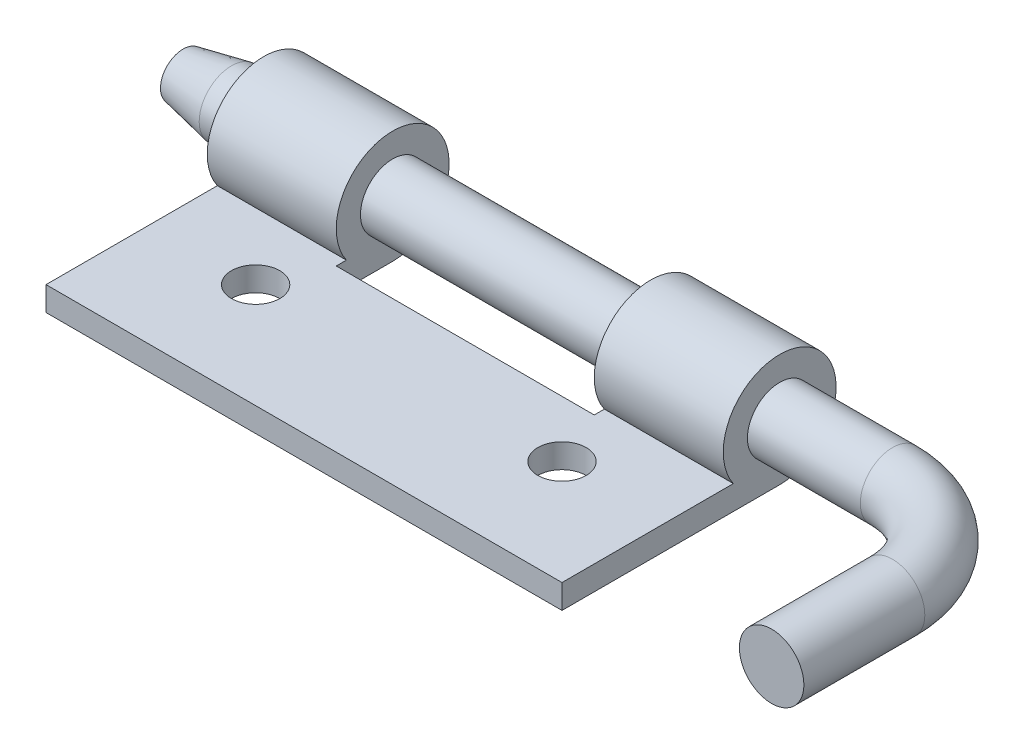
ISO-10303-21;
HEADER;
FILE_DESCRIPTION(('STEP AP214'),'2;1');
FILE_NAME('part.step','',(''),(''),'','','');
FILE_SCHEMA(('AUTOMOTIVE_DESIGN { 1 0 10303 214 1 1 1 1 }'));
ENDSEC;
DATA;
#1=APPLICATION_CONTEXT('core data for automotive mechanical design processes');
#2=APPLICATION_PROTOCOL_DEFINITION('international standard','automotive_design',2000,#1);
#3=PRODUCT_CONTEXT('',#1,'mechanical');
#4=PRODUCT('Part','Part','',(#3));
#5=PRODUCT_RELATED_PRODUCT_CATEGORY('part','',(#4));
#6=PRODUCT_DEFINITION_FORMATION('','',#4);
#7=PRODUCT_DEFINITION_CONTEXT('part definition',#1,'design');
#8=PRODUCT_DEFINITION('design','',#6,#7);
#9=PRODUCT_DEFINITION_SHAPE('','',#8);
#10=(LENGTH_UNIT() NAMED_UNIT(*) SI_UNIT(.MILLI.,.METRE.));
#11=(NAMED_UNIT(*) PLANE_ANGLE_UNIT() SI_UNIT($,.RADIAN.));
#12=(NAMED_UNIT(*) SI_UNIT($,.STERADIAN.) SOLID_ANGLE_UNIT());
#13=UNCERTAINTY_MEASURE_WITH_UNIT(LENGTH_MEASURE(1.E-05),#10,'distance_accuracy_value','');
#14=(GEOMETRIC_REPRESENTATION_CONTEXT(3) GLOBAL_UNCERTAINTY_ASSIGNED_CONTEXT((#13)) GLOBAL_UNIT_ASSIGNED_CONTEXT((#10,
#11,#12)) REPRESENTATION_CONTEXT('',''));
#15=CARTESIAN_POINT('',(0.,0.,0.));
#16=DIRECTION('',(0.,0.,1.));
#17=DIRECTION('',(1.,0.,0.));
#18=AXIS2_PLACEMENT_3D('',#15,#16,#17);
#19=CARTESIAN_POINT('',(-5.,0.,0.));
#20=DIRECTION('',(1.,0.,0.));
#21=DIRECTION('',(0.,0.,-1.));
#22=AXIS2_PLACEMENT_3D('',#19,#20,#21);
#23=CYLINDRICAL_SURFACE('',#22,2.);
#24=CARTESIAN_POINT('',(0.,0.,0.));
#25=DIRECTION('',(1.,0.,0.));
#26=DIRECTION('',(0.,0.,-1.));
#27=AXIS2_PLACEMENT_3D('',#24,#25,#26);
#28=CIRCLE('',#27,2.);
#29=CARTESIAN_POINT('',(0.,0.,-2.));
#30=VERTEX_POINT('',#29);
#31=EDGE_CURVE('E226',#30,#30,#28,.T.);
#32=ORIENTED_EDGE('',*,*,#31,.F.);
#33=EDGE_LOOP('',(#32));
#34=FACE_BOUND('',#33,.T.);
#35=CARTESIAN_POINT('',(-2.,0.,0.));
#36=DIRECTION('',(-1.,0.,0.));
#37=DIRECTION('',(0.,0.,1.));
#38=AXIS2_PLACEMENT_3D('',#35,#36,#37);
#39=CIRCLE('',#38,2.);
#40=CARTESIAN_POINT('',(-2.,0.,2.));
#41=VERTEX_POINT('',#40);
#42=EDGE_CURVE('E320',#41,#41,#39,.T.);
#43=ORIENTED_EDGE('',*,*,#42,.F.);
#44=EDGE_LOOP('',(#43));
#45=FACE_BOUND('',#44,.T.);
#46=ADVANCED_FACE('F45',(#34,#45),#23,.T.);
#47=CARTESIAN_POINT('',(8.,0.,0.));
#48=DIRECTION('',(-1.,0.,0.));
#49=DIRECTION('',(0.,0.,1.));
#50=AXIS2_PLACEMENT_3D('',#47,#48,#49);
#51=CYLINDRICAL_SURFACE('',#50,3.5);
#52=CARTESIAN_POINT('',(0.,0.,0.));
#53=DIRECTION('',(1.,0.,0.));
#54=DIRECTION('',(0.,0.,-1.));
#55=AXIS2_PLACEMENT_3D('',#52,#53,#54);
#56=CIRCLE('',#55,3.5);
#57=CARTESIAN_POINT('',(0.,-3.5,0.));
#58=VERTEX_POINT('',#57);
#59=CARTESIAN_POINT('',(0.,-2.,2.87228132326901));
#60=VERTEX_POINT('',#59);
#61=EDGE_CURVE('E174',#58,#60,#56,.T.);
#62=ORIENTED_EDGE('',*,*,#61,.T.);
#63=DIRECTION('',(-1.,0.,0.));
#64=VECTOR('',#63,1.);
#65=CARTESIAN_POINT('',(8.,-2.,2.87228132326901));
#66=LINE('',#65,#64);
#67=CARTESIAN_POINT('',(8.,-2.,2.87228132326901));
#68=VERTEX_POINT('',#67);
#69=EDGE_CURVE('E63',#60,#68,#66,.F.);
#70=ORIENTED_EDGE('',*,*,#69,.T.);
#71=CARTESIAN_POINT('',(8.,0.,0.));
#72=DIRECTION('',(1.,0.,0.));
#73=DIRECTION('',(0.,0.,-1.));
#74=AXIS2_PLACEMENT_3D('',#71,#72,#73);
#75=CIRCLE('',#74,3.5);
#76=CARTESIAN_POINT('',(8.,-3.5,0.));
#77=VERTEX_POINT('',#76);
#78=EDGE_CURVE('E55',#77,#68,#75,.T.);
#79=ORIENTED_EDGE('',*,*,#78,.F.);
#80=DIRECTION('',(-1.,0.,0.));
#81=VECTOR('',#80,1.);
#82=CARTESIAN_POINT('',(0.,-3.5,0.));
#83=LINE('',#82,#81);
#84=EDGE_CURVE('E68',#77,#58,#83,.T.);
#85=ORIENTED_EDGE('',*,*,#84,.T.);
#86=EDGE_LOOP('',(#62,#70,#79,#85));
#87=FACE_BOUND('',#86,.T.);
#88=ADVANCED_FACE('F47',(#87),#51,.T.);
#89=CARTESIAN_POINT('',(8.,0.,0.));
#90=DIRECTION('',(1.,0.,0.));
#91=DIRECTION('',(0.,0.,-1.));
#92=AXIS2_PLACEMENT_3D('',#89,#90,#91);
#93=PLANE('',#92);
#94=CARTESIAN_POINT('',(8.,0.,0.));
#95=DIRECTION('',(1.,0.,0.));
#96=DIRECTION('',(0.,0.,-1.));
#97=AXIS2_PLACEMENT_3D('',#94,#95,#96);
#98=CIRCLE('',#97,2.);
#99=CARTESIAN_POINT('',(8.,0.,-2.));
#100=VERTEX_POINT('',#99);
#101=EDGE_CURVE('E11',#100,#100,#98,.T.);
#102=ORIENTED_EDGE('',*,*,#101,.F.);
#103=EDGE_LOOP('',(#102));
#104=FACE_BOUND('',#103,.T.);
#105=ORIENTED_EDGE('',*,*,#78,.T.);
#106=DIRECTION('',(0.,0.,-1.));
#107=VECTOR('',#106,1.);
#108=CARTESIAN_POINT('',(8.,-2.,0.));
#109=LINE('',#108,#107);
#110=CARTESIAN_POINT('',(8.,-2.,3.5));
#111=VERTEX_POINT('',#110);
#112=EDGE_CURVE('E162',#111,#68,#109,.T.);
#113=ORIENTED_EDGE('',*,*,#112,.F.);
#114=DIRECTION('',(0.,-1.,0.));
#115=VECTOR('',#114,1.);
#116=CARTESIAN_POINT('',(8.,-2.,3.5));
#117=LINE('',#116,#115);
#118=CARTESIAN_POINT('',(8.,-3.5,3.5));
#119=VERTEX_POINT('',#118);
#120=EDGE_CURVE('E157',#111,#119,#117,.T.);
#121=ORIENTED_EDGE('',*,*,#120,.T.);
#122=DIRECTION('',(0.,0.,-1.));
#123=VECTOR('',#122,1.);
#124=CARTESIAN_POINT('',(8.,-3.5,0.));
#125=LINE('',#124,#123);
#126=EDGE_CURVE('E150',#119,#77,#125,.T.);
#127=ORIENTED_EDGE('',*,*,#126,.T.);
#128=EDGE_LOOP('',(#105,#113,#121,#127));
#129=FACE_BOUND('',#128,.T.);
#130=ADVANCED_FACE('F216',(#104,#129),#93,.T.);
#131=CARTESIAN_POINT('',(0.,0.,0.));
#132=DIRECTION('',(1.,0.,0.));
#133=DIRECTION('',(0.,0.,-1.));
#134=AXIS2_PLACEMENT_3D('',#131,#132,#133);
#135=PLANE('',#134);
#136=ORIENTED_EDGE('',*,*,#31,.T.);
#137=EDGE_LOOP('',(#136));
#138=FACE_BOUND('',#137,.T.);
#139=ORIENTED_EDGE('',*,*,#61,.F.);
#140=DIRECTION('',(0.,0.,1.));
#141=VECTOR('',#140,1.);
#142=CARTESIAN_POINT('',(0.,-3.5,0.));
#143=LINE('',#142,#141);
#144=CARTESIAN_POINT('',(0.,-3.5,13.5));
#145=VERTEX_POINT('',#144);
#146=EDGE_CURVE('E208',#58,#145,#143,.T.);
#147=ORIENTED_EDGE('',*,*,#146,.T.);
#148=DIRECTION('',(0.,-1.,0.));
#149=VECTOR('',#148,1.);
#150=CARTESIAN_POINT('',(0.,-2.,13.5));
#151=LINE('',#150,#149);
#152=CARTESIAN_POINT('',(0.,-2.,13.5));
#153=VERTEX_POINT('',#152);
#154=EDGE_CURVE('E168',#153,#145,#151,.T.);
#155=ORIENTED_EDGE('',*,*,#154,.F.);
#156=DIRECTION('',(0.,0.,1.));
#157=VECTOR('',#156,1.);
#158=CARTESIAN_POINT('',(0.,-2.,0.));
#159=LINE('',#158,#157);
#160=EDGE_CURVE('E156',#60,#153,#159,.T.);
#161=ORIENTED_EDGE('',*,*,#160,.F.);
#162=EDGE_LOOP('',(#139,#147,#155,#161));
#163=FACE_BOUND('',#162,.T.);
#164=ADVANCED_FACE('F187',(#138,#163),#135,.F.);
#165=CARTESIAN_POINT('',(0.,-2.,0.));
#166=DIRECTION('',(0.,1.,0.));
#167=DIRECTION('',(0.,0.,1.));
#168=AXIS2_PLACEMENT_3D('',#165,#166,#167);
#169=PLANE('',#168);
#170=DIRECTION('',(-1.,0.,0.));
#171=VECTOR('',#170,1.);
#172=CARTESIAN_POINT('',(32.,-2.,2.87228132326901));
#173=LINE('',#172,#171);
#174=CARTESIAN_POINT('',(24.,-2.,2.87228132326901));
#175=VERTEX_POINT('',#174);
#176=CARTESIAN_POINT('',(32.,-2.,2.87228132326901));
#177=VERTEX_POINT('',#176);
#178=EDGE_CURVE('E119',#175,#177,#173,.F.);
#179=ORIENTED_EDGE('',*,*,#178,.F.);
#180=DIRECTION('',(0.,0.,1.));
#181=VECTOR('',#180,1.);
#182=CARTESIAN_POINT('',(24.,-2.,3.5));
#183=LINE('',#182,#181);
#184=CARTESIAN_POINT('',(24.,-2.,3.5));
#185=VERTEX_POINT('',#184);
#186=EDGE_CURVE('E200',#175,#185,#183,.T.);
#187=ORIENTED_EDGE('',*,*,#186,.T.);
#188=DIRECTION('',(-1.,0.,0.));
#189=VECTOR('',#188,1.);
#190=CARTESIAN_POINT('',(8.,-2.,3.5));
#191=LINE('',#190,#189);
#192=EDGE_CURVE('E203',#185,#111,#191,.T.);
#193=ORIENTED_EDGE('',*,*,#192,.T.);
#194=ORIENTED_EDGE('',*,*,#112,.T.);
#195=ORIENTED_EDGE('',*,*,#69,.F.);
#196=ORIENTED_EDGE('',*,*,#160,.T.);
#197=DIRECTION('',(1.,0.,0.));
#198=VECTOR('',#197,1.);
#199=CARTESIAN_POINT('',(0.,-2.,13.5));
#200=LINE('',#199,#198);
#201=CARTESIAN_POINT('',(32.,-2.,13.5));
#202=VERTEX_POINT('',#201);
#203=EDGE_CURVE('E189',#153,#202,#200,.T.);
#204=ORIENTED_EDGE('',*,*,#203,.T.);
#205=DIRECTION('',(0.,0.,-1.));
#206=VECTOR('',#205,1.);
#207=CARTESIAN_POINT('',(32.,-2.,0.));
#208=LINE('',#207,#206);
#209=EDGE_CURVE('E192',#202,#177,#208,.T.);
#210=ORIENTED_EDGE('',*,*,#209,.T.);
#211=EDGE_LOOP('',(#179,#187,#193,#194,#195,#196,#204,#210));
#212=FACE_BOUND('',#211,.T.);
#213=CARTESIAN_POINT('',(6.5,-2.,7.));
#214=DIRECTION('',(0.,1.,0.));
#215=DIRECTION('',(0.,0.,1.));
#216=AXIS2_PLACEMENT_3D('',#213,#214,#215);
#217=CIRCLE('',#216,1.5);
#218=CARTESIAN_POINT('',(6.5,-2.,8.5));
#219=VERTEX_POINT('',#218);
#220=EDGE_CURVE('E236',#219,#219,#217,.T.);
#221=ORIENTED_EDGE('',*,*,#220,.F.);
#222=EDGE_LOOP('',(#221));
#223=FACE_BOUND('',#222,.T.);
#224=CARTESIAN_POINT('',(25.5,-2.,7.));
#225=DIRECTION('',(0.,1.,0.));
#226=DIRECTION('',(0.,0.,1.));
#227=AXIS2_PLACEMENT_3D('',#224,#225,#226);
#228=CIRCLE('',#227,1.5);
#229=CARTESIAN_POINT('',(25.5,-2.,8.5));
#230=VERTEX_POINT('',#229);
#231=EDGE_CURVE('E210',#230,#230,#228,.T.);
#232=ORIENTED_EDGE('',*,*,#231,.F.);
#233=EDGE_LOOP('',(#232));
#234=FACE_BOUND('',#233,.T.);
#235=ADVANCED_FACE('F182',(#212,#223,#234),#169,.T.);
#236=CARTESIAN_POINT('',(0.,-3.5,0.));
#237=DIRECTION('',(0.,1.,0.));
#238=DIRECTION('',(0.,0.,1.));
#239=AXIS2_PLACEMENT_3D('',#236,#237,#238);
#240=PLANE('',#239);
#241=ORIENTED_EDGE('',*,*,#146,.F.);
#242=ORIENTED_EDGE('',*,*,#84,.F.);
#243=ORIENTED_EDGE('',*,*,#126,.F.);
#244=DIRECTION('',(-1.,0.,0.));
#245=VECTOR('',#244,1.);
#246=CARTESIAN_POINT('',(8.,-3.5,3.5));
#247=LINE('',#246,#245);
#248=CARTESIAN_POINT('',(24.,-3.5,3.5));
#249=VERTEX_POINT('',#248);
#250=EDGE_CURVE('E144',#249,#119,#247,.T.);
#251=ORIENTED_EDGE('',*,*,#250,.F.);
#252=DIRECTION('',(0.,0.,1.));
#253=VECTOR('',#252,1.);
#254=CARTESIAN_POINT('',(24.,-3.5,3.5));
#255=LINE('',#254,#253);
#256=CARTESIAN_POINT('',(24.,-3.5,0.));
#257=VERTEX_POINT('',#256);
#258=EDGE_CURVE('E140',#257,#249,#255,.T.);
#259=ORIENTED_EDGE('',*,*,#258,.F.);
#260=DIRECTION('',(-1.,0.,0.));
#261=VECTOR('',#260,1.);
#262=CARTESIAN_POINT('',(24.,-3.5,0.));
#263=LINE('',#262,#261);
#264=CARTESIAN_POINT('',(32.,-3.5,0.));
#265=VERTEX_POINT('',#264);
#266=EDGE_CURVE('E116',#265,#257,#263,.T.);
#267=ORIENTED_EDGE('',*,*,#266,.F.);
#268=DIRECTION('',(0.,0.,-1.));
#269=VECTOR('',#268,1.);
#270=CARTESIAN_POINT('',(32.,-3.5,0.));
#271=LINE('',#270,#269);
#272=CARTESIAN_POINT('',(32.,-3.5,13.5));
#273=VERTEX_POINT('',#272);
#274=EDGE_CURVE('E128',#273,#265,#271,.T.);
#275=ORIENTED_EDGE('',*,*,#274,.F.);
#276=DIRECTION('',(1.,0.,0.));
#277=VECTOR('',#276,1.);
#278=CARTESIAN_POINT('',(0.,-3.5,13.5));
#279=LINE('',#278,#277);
#280=EDGE_CURVE('E134',#145,#273,#279,.T.);
#281=ORIENTED_EDGE('',*,*,#280,.F.);
#282=EDGE_LOOP('',(#241,#242,#243,#251,#259,#267,#275,#281));
#283=FACE_BOUND('',#282,.T.);
#284=CARTESIAN_POINT('',(25.5,-3.5,7.));
#285=DIRECTION('',(0.,1.,0.));
#286=DIRECTION('',(0.,0.,1.));
#287=AXIS2_PLACEMENT_3D('',#284,#285,#286);
#288=CIRCLE('',#287,1.5);
#289=CARTESIAN_POINT('',(25.5,-3.5,8.5));
#290=VERTEX_POINT('',#289);
#291=EDGE_CURVE('E195',#290,#290,#288,.T.);
#292=ORIENTED_EDGE('',*,*,#291,.T.);
#293=EDGE_LOOP('',(#292));
#294=FACE_BOUND('',#293,.T.);
#295=CARTESIAN_POINT('',(6.5,-3.5,7.));
#296=DIRECTION('',(0.,1.,0.));
#297=DIRECTION('',(0.,0.,1.));
#298=AXIS2_PLACEMENT_3D('',#295,#296,#297);
#299=CIRCLE('',#298,1.5);
#300=CARTESIAN_POINT('',(6.5,-3.5,8.5));
#301=VERTEX_POINT('',#300);
#302=EDGE_CURVE('E235',#301,#301,#299,.T.);
#303=ORIENTED_EDGE('',*,*,#302,.T.);
#304=EDGE_LOOP('',(#303));
#305=FACE_BOUND('',#304,.T.);
#306=ADVANCED_FACE('F137',(#283,#294,#305),#240,.F.);
#307=CARTESIAN_POINT('',(0.,-2.,13.5));
#308=DIRECTION('',(0.,0.,-1.));
#309=DIRECTION('',(-1.,0.,0.));
#310=AXIS2_PLACEMENT_3D('',#307,#308,#309);
#311=PLANE('',#310);
#312=ORIENTED_EDGE('',*,*,#280,.T.);
#313=DIRECTION('',(0.,-1.,0.));
#314=VECTOR('',#313,1.);
#315=CARTESIAN_POINT('',(32.,-2.,13.5));
#316=LINE('',#315,#314);
#317=EDGE_CURVE('E131',#202,#273,#316,.T.);
#318=ORIENTED_EDGE('',*,*,#317,.F.);
#319=ORIENTED_EDGE('',*,*,#203,.F.);
#320=ORIENTED_EDGE('',*,*,#154,.T.);
#321=EDGE_LOOP('',(#312,#318,#319,#320));
#322=FACE_BOUND('',#321,.T.);
#323=ADVANCED_FACE('F213',(#322),#311,.F.);
#324=CARTESIAN_POINT('',(32.,-2.,0.));
#325=DIRECTION('',(-1.,0.,0.));
#326=DIRECTION('',(0.,0.,1.));
#327=AXIS2_PLACEMENT_3D('',#324,#325,#326);
#328=PLANE('',#327);
#329=CARTESIAN_POINT('',(32.,0.,0.));
#330=DIRECTION('',(-1.,0.,0.));
#331=DIRECTION('',(0.,0.,1.));
#332=AXIS2_PLACEMENT_3D('',#329,#330,#331);
#333=CIRCLE('',#332,2.);
#334=CARTESIAN_POINT('',(32.,0.,2.));
#335=VERTEX_POINT('',#334);
#336=EDGE_CURVE('E230',#335,#335,#333,.T.);
#337=ORIENTED_EDGE('',*,*,#336,.T.);
#338=EDGE_LOOP('',(#337));
#339=FACE_BOUND('',#338,.T.);
#340=CARTESIAN_POINT('',(32.,0.,0.));
#341=DIRECTION('',(-1.,0.,0.));
#342=DIRECTION('',(0.,0.,1.));
#343=AXIS2_PLACEMENT_3D('',#340,#341,#342);
#344=CIRCLE('',#343,3.5);
#345=EDGE_CURVE('E112',#177,#265,#344,.T.);
#346=ORIENTED_EDGE('',*,*,#345,.F.);
#347=ORIENTED_EDGE('',*,*,#209,.F.);
#348=ORIENTED_EDGE('',*,*,#317,.T.);
#349=ORIENTED_EDGE('',*,*,#274,.T.);
#350=EDGE_LOOP('',(#346,#347,#348,#349));
#351=FACE_BOUND('',#350,.T.);
#352=ADVANCED_FACE('F129',(#339,#351),#328,.F.);
#353=CARTESIAN_POINT('',(24.,-2.,3.5));
#354=DIRECTION('',(1.,0.,0.));
#355=DIRECTION('',(0.,0.,-1.));
#356=AXIS2_PLACEMENT_3D('',#353,#354,#355);
#357=PLANE('',#356);
#358=CARTESIAN_POINT('',(24.,0.,0.));
#359=DIRECTION('',(1.,0.,0.));
#360=DIRECTION('',(0.,0.,-1.));
#361=AXIS2_PLACEMENT_3D('',#358,#359,#360);
#362=CIRCLE('',#361,2.);
#363=CARTESIAN_POINT('',(24.,0.,-2.));
#364=VERTEX_POINT('',#363);
#365=EDGE_CURVE('E49',#364,#364,#362,.T.);
#366=ORIENTED_EDGE('',*,*,#365,.T.);
#367=EDGE_LOOP('',(#366));
#368=FACE_BOUND('',#367,.T.);
#369=ORIENTED_EDGE('',*,*,#186,.F.);
#370=CARTESIAN_POINT('',(24.,0.,0.));
#371=DIRECTION('',(-1.,0.,0.));
#372=DIRECTION('',(0.,0.,1.));
#373=AXIS2_PLACEMENT_3D('',#370,#371,#372);
#374=CIRCLE('',#373,3.5);
#375=EDGE_CURVE('E124',#175,#257,#374,.T.);
#376=ORIENTED_EDGE('',*,*,#375,.T.);
#377=ORIENTED_EDGE('',*,*,#258,.T.);
#378=DIRECTION('',(0.,-1.,0.));
#379=VECTOR('',#378,1.);
#380=CARTESIAN_POINT('',(24.,-2.,3.5));
#381=LINE('',#380,#379);
#382=EDGE_CURVE('E161',#185,#249,#381,.T.);
#383=ORIENTED_EDGE('',*,*,#382,.F.);
#384=EDGE_LOOP('',(#369,#376,#377,#383));
#385=FACE_BOUND('',#384,.T.);
#386=ADVANCED_FACE('F224',(#368,#385),#357,.F.);
#387=CARTESIAN_POINT('',(8.,-2.,3.5));
#388=DIRECTION('',(0.,0.,1.));
#389=DIRECTION('',(1.,0.,0.));
#390=AXIS2_PLACEMENT_3D('',#387,#388,#389);
#391=PLANE('',#390);
#392=ORIENTED_EDGE('',*,*,#250,.T.);
#393=ORIENTED_EDGE('',*,*,#120,.F.);
#394=ORIENTED_EDGE('',*,*,#192,.F.);
#395=ORIENTED_EDGE('',*,*,#382,.T.);
#396=EDGE_LOOP('',(#392,#393,#394,#395));
#397=FACE_BOUND('',#396,.T.);
#398=ADVANCED_FACE('F220',(#397),#391,.F.);
#399=CARTESIAN_POINT('',(25.5,-2.,7.));
#400=DIRECTION('',(0.,-1.,0.));
#401=DIRECTION('',(0.,0.,-1.));
#402=AXIS2_PLACEMENT_3D('',#399,#400,#401);
#403=CYLINDRICAL_SURFACE('',#402,1.5);
#404=ORIENTED_EDGE('',*,*,#231,.T.);
#405=EDGE_LOOP('',(#404));
#406=FACE_BOUND('',#405,.T.);
#407=ORIENTED_EDGE('',*,*,#291,.F.);
#408=EDGE_LOOP('',(#407));
#409=FACE_BOUND('',#408,.T.);
#410=ADVANCED_FACE('F251',(#406,#409),#403,.F.);
#411=CARTESIAN_POINT('',(6.5,-2.,7.));
#412=DIRECTION('',(0.,-1.,0.));
#413=DIRECTION('',(0.,0.,-1.));
#414=AXIS2_PLACEMENT_3D('',#411,#412,#413);
#415=CYLINDRICAL_SURFACE('',#414,1.5);
#416=ORIENTED_EDGE('',*,*,#220,.T.);
#417=EDGE_LOOP('',(#416));
#418=FACE_BOUND('',#417,.T.);
#419=ORIENTED_EDGE('',*,*,#302,.F.);
#420=EDGE_LOOP('',(#419));
#421=FACE_BOUND('',#420,.T.);
#422=ADVANCED_FACE('F253',(#418,#421),#415,.F.);
#423=CARTESIAN_POINT('',(32.,0.,0.));
#424=DIRECTION('',(-1.,0.,0.));
#425=DIRECTION('',(0.,0.,1.));
#426=AXIS2_PLACEMENT_3D('',#423,#424,#425);
#427=CYLINDRICAL_SURFACE('',#426,3.5);
#428=ORIENTED_EDGE('',*,*,#375,.F.);
#429=ORIENTED_EDGE('',*,*,#178,.T.);
#430=ORIENTED_EDGE('',*,*,#345,.T.);
#431=ORIENTED_EDGE('',*,*,#266,.T.);
#432=EDGE_LOOP('',(#428,#429,#430,#431));
#433=FACE_BOUND('',#432,.T.);
#434=ADVANCED_FACE('F114',(#433),#427,.T.);
#435=ORIENTED_EDGE('',*,*,#101,.T.);
#436=EDGE_LOOP('',(#435));
#437=FACE_BOUND('',#436,.T.);
#438=ORIENTED_EDGE('',*,*,#365,.F.);
#439=EDGE_LOOP('',(#438));
#440=FACE_BOUND('',#439,.T.);
#441=ADVANCED_FACE('F267',(#437,#440),#23,.T.);
#442=CARTESIAN_POINT('',(45.,0.,6.00000000000001));
#443=DIRECTION('',(0.,0.,1.));
#444=DIRECTION('',(1.,0.,0.));
#445=AXIS2_PLACEMENT_3D('',#442,#443,#444);
#446=CYLINDRICAL_SURFACE('',#445,2.);
#447=CARTESIAN_POINT('',(45.,0.,13.5));
#448=DIRECTION('',(0.,0.,1.));
#449=DIRECTION('',(1.,0.,0.));
#450=AXIS2_PLACEMENT_3D('',#447,#448,#449);
#451=CIRCLE('',#450,2.);
#452=CARTESIAN_POINT('',(47.,0.,13.5));
#453=VERTEX_POINT('',#452);
#454=EDGE_CURVE('E298',#453,#453,#451,.T.);
#455=ORIENTED_EDGE('',*,*,#454,.F.);
#456=EDGE_LOOP('',(#455));
#457=FACE_BOUND('',#456,.T.);
#458=CARTESIAN_POINT('',(45.,0.,6.00000000000001));
#459=DIRECTION('',(0.,0.,1.));
#460=DIRECTION('',(1.,0.,0.));
#461=AXIS2_PLACEMENT_3D('',#458,#459,#460);
#462=CIRCLE('',#461,2.);
#463=CARTESIAN_POINT('',(47.,0.,6.00000000000001));
#464=VERTEX_POINT('',#463);
#465=EDGE_CURVE('E304',#464,#464,#462,.T.);
#466=ORIENTED_EDGE('',*,*,#465,.T.);
#467=EDGE_LOOP('',(#466));
#468=FACE_BOUND('',#467,.T.);
#469=ADVANCED_FACE('F281',(#457,#468),#446,.T.);
#470=CARTESIAN_POINT('',(39.,0.,6.00000000000001));
#471=DIRECTION('',(0.,-1.,0.));
#472=DIRECTION('',(0.,0.,-1.));
#473=AXIS2_PLACEMENT_3D('',#470,#471,#472);
#474=TOROIDAL_SURFACE('',#473,6.00000000000001,2.);
#475=CARTESIAN_POINT('',(39.,0.,0.));
#476=DIRECTION('',(1.,0.,0.));
#477=DIRECTION('',(0.,0.,-1.));
#478=AXIS2_PLACEMENT_3D('',#475,#476,#477);
#479=CIRCLE('',#478,2.);
#480=CARTESIAN_POINT('',(39.,0.,-2.));
#481=VERTEX_POINT('',#480);
#482=EDGE_CURVE('E310',#481,#481,#479,.T.);
#483=CARTESIAN_POINT('',(39.,0.,6.00000000000001));
#484=DIRECTION('',(0.,-1.,0.));
#485=DIRECTION('',(0.,0.,-1.));
#486=AXIS2_PLACEMENT_3D('',#483,#484,#485);
#487=CIRCLE('',#486,8.00000000000001);
#488=EDGE_CURVE('',#481,#464,#487,.T.);
#489=ORIENTED_EDGE('',*,*,#482,.T.);
#490=ORIENTED_EDGE('',*,*,#465,.F.);
#491=ORIENTED_EDGE('',*,*,#488,.T.);
#492=ORIENTED_EDGE('',*,*,#488,.F.);
#493=EDGE_LOOP('',(#489,#491,#490,#492));
#494=FACE_BOUND('',#493,.T.);
#495=ADVANCED_FACE('F287',(#494),#474,.T.);
#496=CARTESIAN_POINT('',(45.,0.,13.5));
#497=DIRECTION('',(0.,0.,1.));
#498=DIRECTION('',(1.,0.,0.));
#499=AXIS2_PLACEMENT_3D('',#496,#497,#498);
#500=PLANE('',#499);
#501=ORIENTED_EDGE('',*,*,#454,.T.);
#502=EDGE_LOOP('',(#501));
#503=FACE_BOUND('',#502,.T.);
#504=ADVANCED_FACE('F278',(#503),#500,.T.);
#505=ORIENTED_EDGE('',*,*,#482,.F.);
#506=EDGE_LOOP('',(#505));
#507=FACE_BOUND('',#506,.T.);
#508=ORIENTED_EDGE('',*,*,#336,.F.);
#509=EDGE_LOOP('',(#508));
#510=FACE_BOUND('',#509,.T.);
#511=ADVANCED_FACE('F266',(#507,#510),#23,.T.);
#512=CARTESIAN_POINT('',(-5.,0.,0.));
#513=DIRECTION('',(1.,0.,0.));
#514=DIRECTION('',(0.,0.,-1.));
#515=AXIS2_PLACEMENT_3D('',#512,#513,#514);
#516=CONICAL_SURFACE('',#515,1.4,0.197395559849881);
#517=ORIENTED_EDGE('',*,*,#42,.T.);
#518=EDGE_LOOP('',(#517));
#519=FACE_BOUND('',#518,.T.);
#520=CARTESIAN_POINT('',(-5.,0.,0.));
#521=DIRECTION('',(-1.,0.,0.));
#522=DIRECTION('',(0.,0.,1.));
#523=AXIS2_PLACEMENT_3D('',#520,#521,#522);
#524=CIRCLE('',#523,1.4);
#525=CARTESIAN_POINT('',(-5.,0.,1.4));
#526=VERTEX_POINT('',#525);
#527=EDGE_CURVE('E316',#526,#526,#524,.T.);
#528=ORIENTED_EDGE('',*,*,#527,.F.);
#529=EDGE_LOOP('',(#528));
#530=FACE_BOUND('',#529,.T.);
#531=ADVANCED_FACE('F277',(#519,#530),#516,.T.);
#532=CARTESIAN_POINT('',(-5.,0.,0.));
#533=DIRECTION('',(1.,0.,0.));
#534=DIRECTION('',(0.,0.,-1.));
#535=AXIS2_PLACEMENT_3D('',#532,#533,#534);
#536=PLANE('',#535);
#537=ORIENTED_EDGE('',*,*,#527,.T.);
#538=EDGE_LOOP('',(#537));
#539=FACE_BOUND('',#538,.T.);
#540=ADVANCED_FACE('F326',(#539),#536,.F.);
#541=CLOSED_SHELL('',(#46,#88,#130,#164,#235,#306,#323,#352,#386,#398,#410,#422,#434,#441,#469,
#495,#504,#511,#531,#540));
#542=MANIFOLD_SOLID_BREP('B2',#541);
#543=ADVANCED_BREP_SHAPE_REPRESENTATION('',(#18,#542),#14);
#544=SHAPE_DEFINITION_REPRESENTATION(#9,#543);
ENDSEC;
END-ISO-10303-21;
